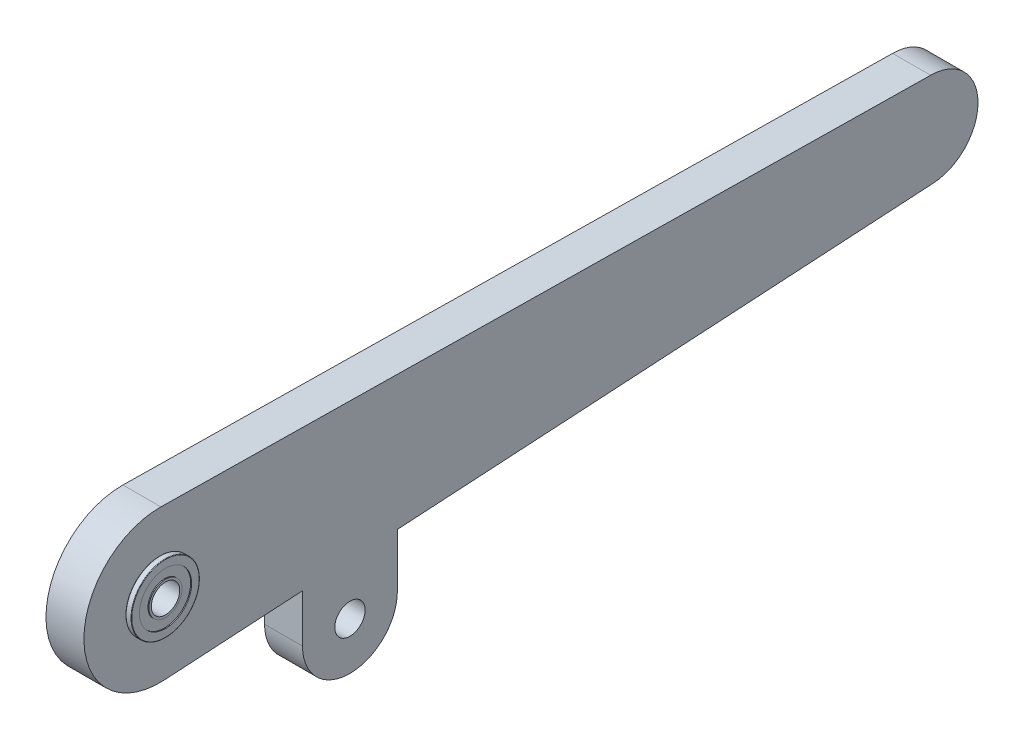
ISO-10303-21;
HEADER;
FILE_DESCRIPTION(('STEP AP214'),'2;1');
FILE_NAME('part.step','',(''),(''),'','','');
FILE_SCHEMA(('AUTOMOTIVE_DESIGN { 1 0 10303 214 1 1 1 1 }'));
ENDSEC;
DATA;
#1=APPLICATION_CONTEXT('core data for automotive mechanical design processes');
#2=APPLICATION_PROTOCOL_DEFINITION('international standard','automotive_design',2000,#1);
#3=PRODUCT_CONTEXT('',#1,'mechanical');
#4=PRODUCT('Part','Part','',(#3));
#5=PRODUCT_RELATED_PRODUCT_CATEGORY('part','',(#4));
#6=PRODUCT_DEFINITION_FORMATION('','',#4);
#7=PRODUCT_DEFINITION_CONTEXT('part definition',#1,'design');
#8=PRODUCT_DEFINITION('design','',#6,#7);
#9=PRODUCT_DEFINITION_SHAPE('','',#8);
#10=(LENGTH_UNIT() NAMED_UNIT(*) SI_UNIT(.MILLI.,.METRE.));
#11=(NAMED_UNIT(*) PLANE_ANGLE_UNIT() SI_UNIT($,.RADIAN.));
#12=(NAMED_UNIT(*) SI_UNIT($,.STERADIAN.) SOLID_ANGLE_UNIT());
#13=UNCERTAINTY_MEASURE_WITH_UNIT(LENGTH_MEASURE(1.E-05),#10,'distance_accuracy_value','');
#14=(GEOMETRIC_REPRESENTATION_CONTEXT(3) GLOBAL_UNCERTAINTY_ASSIGNED_CONTEXT((#13)) GLOBAL_UNIT_ASSIGNED_CONTEXT((#10,
#11,#12)) REPRESENTATION_CONTEXT('',''));
#15=CARTESIAN_POINT('',(0.,0.,0.));
#16=DIRECTION('',(0.,0.,1.));
#17=DIRECTION('',(1.,0.,0.));
#18=AXIS2_PLACEMENT_3D('',#15,#16,#17);
#19=CARTESIAN_POINT('',(3.35,0.,0.));
#20=DIRECTION('',(1.,0.,0.));
#21=DIRECTION('',(0.,0.,1.));
#22=AXIS2_PLACEMENT_3D('',#19,#20,#21);
#23=CYLINDRICAL_SURFACE('',#22,1.5);
#24=CARTESIAN_POINT('',(4.6,0.,0.));
#25=DIRECTION('',(1.,0.,0.));
#26=DIRECTION('',(0.,0.,-1.));
#27=AXIS2_PLACEMENT_3D('',#24,#25,#26);
#28=CIRCLE('',#27,1.5);
#29=CARTESIAN_POINT('',(4.59999999999999,0.,-1.50000000000002));
#30=VERTEX_POINT('',#29);
#31=EDGE_CURVE('P0_E28',#30,#30,#28,.T.);
#32=ORIENTED_EDGE('',*,*,#31,.T.);
#33=DIRECTION('',(-1.,0.,0.));
#34=VECTOR('',#33,1.);
#35=CARTESIAN_POINT('',(3.34999999999999,0.,-1.50000000000002));
#36=LINE('',#35,#34);
#37=CARTESIAN_POINT('',(2.09999999999999,0.,-1.50000000000001));
#38=VERTEX_POINT('',#37);
#39=EDGE_CURVE('P0_E11',#30,#38,#36,.T.);
#40=ORIENTED_EDGE('',*,*,#39,.T.);
#41=CARTESIAN_POINT('',(2.1,0.,0.));
#42=DIRECTION('',(1.,0.,0.));
#43=DIRECTION('',(0.,0.,-1.));
#44=AXIS2_PLACEMENT_3D('',#41,#42,#43);
#45=CIRCLE('',#44,1.5);
#46=EDGE_CURVE('P0_E179',#38,#38,#45,.T.);
#47=ORIENTED_EDGE('',*,*,#46,.F.);
#48=ORIENTED_EDGE('',*,*,#39,.F.);
#49=EDGE_LOOP('',(#32,#40,#47,#48));
#50=FACE_BOUND('',#49,.T.);
#51=ADVANCED_FACE('P0_F17',(#50),#23,.F.);
#52=CARTESIAN_POINT('',(4.6,0.,1.49999999999998));
#53=DIRECTION('',(1.,0.,0.));
#54=DIRECTION('',(0.,1.,0.));
#55=AXIS2_PLACEMENT_3D('',#52,#53,#54);
#56=PLANE('',#55);
#57=ORIENTED_EDGE('',*,*,#31,.F.);
#58=EDGE_LOOP('',(#57));
#59=FACE_BOUND('',#58,.T.);
#60=CARTESIAN_POINT('',(4.6,0.,0.));
#61=DIRECTION('',(1.,0.,0.));
#62=DIRECTION('',(0.,0.,-1.));
#63=AXIS2_PLACEMENT_3D('',#60,#61,#62);
#64=CIRCLE('',#63,1.75);
#65=CARTESIAN_POINT('',(4.60000000000001,0.,1.74999999999998));
#66=VERTEX_POINT('',#65);
#67=EDGE_CURVE('P0_E171',#66,#66,#64,.T.);
#68=ORIENTED_EDGE('',*,*,#67,.T.);
#69=EDGE_LOOP('',(#68));
#70=FACE_BOUND('',#69,.T.);
#71=ADVANCED_FACE('P0_F244',(#59,#70),#56,.T.);
#72=CARTESIAN_POINT('',(2.10000000000001,0.,2.99999999999999));
#73=DIRECTION('',(-1.,0.,0.));
#74=DIRECTION('',(0.,0.,-1.));
#75=AXIS2_PLACEMENT_3D('',#72,#73,#74);
#76=PLANE('',#75);
#77=ORIENTED_EDGE('',*,*,#46,.T.);
#78=EDGE_LOOP('',(#77));
#79=FACE_BOUND('',#78,.T.);
#80=CARTESIAN_POINT('',(2.1,0.,0.));
#81=DIRECTION('',(-1.,0.,0.));
#82=DIRECTION('',(0.,0.,1.));
#83=AXIS2_PLACEMENT_3D('',#80,#81,#82);
#84=CIRCLE('',#83,1.75);
#85=CARTESIAN_POINT('',(2.09999999999999,0.,-1.75000000000001));
#86=VERTEX_POINT('',#85);
#87=EDGE_CURVE('P0_E160',#86,#86,#84,.T.);
#88=ORIENTED_EDGE('',*,*,#87,.T.);
#89=EDGE_LOOP('',(#88));
#90=FACE_BOUND('',#89,.T.);
#91=ADVANCED_FACE('P0_F240',(#79,#90),#76,.T.);
#92=CARTESIAN_POINT('',(2.2,0.,0.));
#93=DIRECTION('',(-1.,0.,0.));
#94=DIRECTION('',(0.,0.,-1.));
#95=AXIS2_PLACEMENT_3D('',#92,#93,#94);
#96=PLANE('',#95);
#97=CARTESIAN_POINT('',(2.2,0.,0.));
#98=DIRECTION('',(-1.,0.,0.));
#99=DIRECTION('',(0.,0.,1.));
#100=AXIS2_PLACEMENT_3D('',#97,#98,#99);
#101=CIRCLE('',#100,1.75);
#102=CARTESIAN_POINT('',(2.19999999999999,0.,-1.75000000000001));
#103=VERTEX_POINT('',#102);
#104=EDGE_CURVE('P0_E21',#103,#103,#101,.T.);
#105=ORIENTED_EDGE('',*,*,#104,.F.);
#106=EDGE_LOOP('',(#105));
#107=FACE_BOUND('',#106,.T.);
#108=CARTESIAN_POINT('',(2.2,0.,0.));
#109=DIRECTION('',(1.,0.,0.));
#110=DIRECTION('',(0.,0.,1.));
#111=AXIS2_PLACEMENT_3D('',#108,#109,#110);
#112=CIRCLE('',#111,2.75);
#113=CARTESIAN_POINT('',(2.19999999999999,0.,-2.75000000000001));
#114=VERTEX_POINT('',#113);
#115=EDGE_CURVE('P0_E176',#114,#114,#112,.T.);
#116=ORIENTED_EDGE('',*,*,#115,.F.);
#117=EDGE_LOOP('',(#116));
#118=FACE_BOUND('',#117,.T.);
#119=ADVANCED_FACE('P0_F278',(#107,#118),#96,.T.);
#120=CARTESIAN_POINT('',(2.1,0.,0.));
#121=DIRECTION('',(1.,0.,0.));
#122=DIRECTION('',(0.,0.,1.));
#123=AXIS2_PLACEMENT_3D('',#120,#121,#122);
#124=CYLINDRICAL_SURFACE('',#123,2.75);
#125=CARTESIAN_POINT('',(2.1,0.,0.));
#126=DIRECTION('',(1.,0.,0.));
#127=DIRECTION('',(0.,0.,1.));
#128=AXIS2_PLACEMENT_3D('',#125,#126,#127);
#129=CIRCLE('',#128,2.75);
#130=CARTESIAN_POINT('',(2.09999999999999,0.,-2.75000000000001));
#131=VERTEX_POINT('',#130);
#132=EDGE_CURVE('P0_E172',#131,#131,#129,.T.);
#133=ORIENTED_EDGE('',*,*,#132,.F.);
#134=DIRECTION('',(1.,0.,0.));
#135=VECTOR('',#134,1.);
#136=CARTESIAN_POINT('',(2.09999999999999,0.,-2.75000000000001));
#137=LINE('',#136,#135);
#138=EDGE_CURVE('P0_E84',#131,#114,#137,.T.);
#139=ORIENTED_EDGE('',*,*,#138,.T.);
#140=ORIENTED_EDGE('',*,*,#115,.T.);
#141=ORIENTED_EDGE('',*,*,#138,.F.);
#142=EDGE_LOOP('',(#133,#139,#140,#141));
#143=FACE_BOUND('',#142,.T.);
#144=ADVANCED_FACE('P0_F281',(#143),#124,.F.);
#145=CARTESIAN_POINT('',(2.1,0.,0.));
#146=DIRECTION('',(1.,0.,0.));
#147=DIRECTION('',(0.,0.,1.));
#148=AXIS2_PLACEMENT_3D('',#145,#146,#147);
#149=CYLINDRICAL_SURFACE('',#148,1.75);
#150=ORIENTED_EDGE('',*,*,#87,.F.);
#151=DIRECTION('',(1.,0.,0.));
#152=VECTOR('',#151,1.);
#153=CARTESIAN_POINT('',(2.09999999999999,0.,-1.75000000000001));
#154=LINE('',#153,#152);
#155=EDGE_CURVE('P0_E54',#86,#103,#154,.T.);
#156=ORIENTED_EDGE('',*,*,#155,.T.);
#157=ORIENTED_EDGE('',*,*,#104,.T.);
#158=ORIENTED_EDGE('',*,*,#155,.F.);
#159=EDGE_LOOP('',(#150,#156,#157,#158));
#160=FACE_BOUND('',#159,.T.);
#161=ADVANCED_FACE('P0_F19',(#160),#149,.T.);
#162=CARTESIAN_POINT('',(4.5,0.,0.));
#163=DIRECTION('',(1.,0.,0.));
#164=DIRECTION('',(0.,1.,0.));
#165=AXIS2_PLACEMENT_3D('',#162,#163,#164);
#166=PLANE('',#165);
#167=CARTESIAN_POINT('',(4.5,0.,0.));
#168=DIRECTION('',(1.,0.,0.));
#169=DIRECTION('',(0.,0.,-1.));
#170=AXIS2_PLACEMENT_3D('',#167,#168,#169);
#171=CIRCLE('',#170,1.75);
#172=CARTESIAN_POINT('',(4.50000000000001,0.,1.74999999999998));
#173=VERTEX_POINT('',#172);
#174=EDGE_CURVE('P0_E188',#173,#173,#171,.T.);
#175=ORIENTED_EDGE('',*,*,#174,.F.);
#176=EDGE_LOOP('',(#175));
#177=FACE_BOUND('',#176,.T.);
#178=CARTESIAN_POINT('',(4.5,0.,0.));
#179=DIRECTION('',(-1.,0.,0.));
#180=DIRECTION('',(0.,0.,-1.));
#181=AXIS2_PLACEMENT_3D('',#178,#179,#180);
#182=CIRCLE('',#181,2.75);
#183=CARTESIAN_POINT('',(4.50000000000001,0.,2.74999999999998));
#184=VERTEX_POINT('',#183);
#185=EDGE_CURVE('P0_E69',#184,#184,#182,.T.);
#186=ORIENTED_EDGE('',*,*,#185,.F.);
#187=EDGE_LOOP('',(#186));
#188=FACE_BOUND('',#187,.T.);
#189=ADVANCED_FACE('P0_F260',(#177,#188),#166,.T.);
#190=CARTESIAN_POINT('',(4.6,0.,0.));
#191=DIRECTION('',(-1.,0.,0.));
#192=DIRECTION('',(0.,0.,-1.));
#193=AXIS2_PLACEMENT_3D('',#190,#191,#192);
#194=CYLINDRICAL_SURFACE('',#193,2.75);
#195=CARTESIAN_POINT('',(4.6,0.,0.));
#196=DIRECTION('',(-1.,0.,0.));
#197=DIRECTION('',(0.,0.,-1.));
#198=AXIS2_PLACEMENT_3D('',#195,#196,#197);
#199=CIRCLE('',#198,2.75);
#200=CARTESIAN_POINT('',(4.60000000000001,0.,2.74999999999998));
#201=VERTEX_POINT('',#200);
#202=EDGE_CURVE('P0_E155',#201,#201,#199,.T.);
#203=ORIENTED_EDGE('',*,*,#202,.F.);
#204=DIRECTION('',(-1.,0.,0.));
#205=VECTOR('',#204,1.);
#206=CARTESIAN_POINT('',(4.60000000000001,0.,2.74999999999998));
#207=LINE('',#206,#205);
#208=EDGE_CURVE('P0_E191',#201,#184,#207,.T.);
#209=ORIENTED_EDGE('',*,*,#208,.T.);
#210=ORIENTED_EDGE('',*,*,#185,.T.);
#211=ORIENTED_EDGE('',*,*,#208,.F.);
#212=EDGE_LOOP('',(#203,#209,#210,#211));
#213=FACE_BOUND('',#212,.T.);
#214=ADVANCED_FACE('P0_F218',(#213),#194,.F.);
#215=CARTESIAN_POINT('',(4.6,0.,0.));
#216=DIRECTION('',(-1.,0.,0.));
#217=DIRECTION('',(0.,0.,-1.));
#218=AXIS2_PLACEMENT_3D('',#215,#216,#217);
#219=CYLINDRICAL_SURFACE('',#218,1.75);
#220=ORIENTED_EDGE('',*,*,#67,.F.);
#221=DIRECTION('',(-1.,0.,0.));
#222=VECTOR('',#221,1.);
#223=CARTESIAN_POINT('',(4.60000000000001,0.,1.74999999999998));
#224=LINE('',#223,#222);
#225=EDGE_CURVE('P0_E184',#66,#173,#224,.T.);
#226=ORIENTED_EDGE('',*,*,#225,.T.);
#227=ORIENTED_EDGE('',*,*,#174,.T.);
#228=ORIENTED_EDGE('',*,*,#225,.F.);
#229=EDGE_LOOP('',(#220,#226,#227,#228));
#230=FACE_BOUND('',#229,.T.);
#231=ADVANCED_FACE('P0_F249',(#230),#219,.T.);
#232=CARTESIAN_POINT('',(3.05,0.,0.));
#233=DIRECTION('',(1.,0.,0.));
#234=DIRECTION('',(0.,0.,1.));
#235=AXIS2_PLACEMENT_3D('',#232,#233,#234);
#236=CYLINDRICAL_SURFACE('',#235,3.);
#237=CARTESIAN_POINT('',(4.,0.,0.));
#238=DIRECTION('',(1.,0.,0.));
#239=DIRECTION('',(0.,0.,-1.));
#240=AXIS2_PLACEMENT_3D('',#237,#238,#239);
#241=CIRCLE('',#240,3.);
#242=CARTESIAN_POINT('',(3.99999999999999,0.,-3.00000000000002));
#243=VERTEX_POINT('',#242);
#244=EDGE_CURVE('P0_E146',#243,#243,#241,.T.);
#245=ORIENTED_EDGE('',*,*,#244,.F.);
#246=DIRECTION('',(-1.,0.,0.));
#247=VECTOR('',#246,1.);
#248=CARTESIAN_POINT('',(3.04999999999999,0.,-3.00000000000002));
#249=LINE('',#248,#247);
#250=CARTESIAN_POINT('',(2.14999999999999,0.,-3.00000000000001));
#251=VERTEX_POINT('',#250);
#252=EDGE_CURVE('P0_E138',#243,#251,#249,.T.);
#253=ORIENTED_EDGE('',*,*,#252,.T.);
#254=CARTESIAN_POINT('',(2.15,0.,0.));
#255=DIRECTION('',(-1.,0.,0.));
#256=DIRECTION('',(0.,0.,-1.));
#257=AXIS2_PLACEMENT_3D('',#254,#255,#256);
#258=CIRCLE('',#257,3.);
#259=EDGE_CURVE('P0_E153',#251,#251,#258,.T.);
#260=ORIENTED_EDGE('',*,*,#259,.F.);
#261=ORIENTED_EDGE('',*,*,#252,.F.);
#262=EDGE_LOOP('',(#245,#253,#260,#261));
#263=FACE_BOUND('',#262,.T.);
#264=ADVANCED_FACE('P0_F251',(#263),#236,.T.);
#265=CARTESIAN_POINT('',(2.10000000000001,0.,2.99999999999999));
#266=DIRECTION('',(-1.,0.,0.));
#267=DIRECTION('',(0.,0.,-1.));
#268=AXIS2_PLACEMENT_3D('',#265,#266,#267);
#269=PLANE('',#268);
#270=ORIENTED_EDGE('',*,*,#132,.T.);
#271=EDGE_LOOP('',(#270));
#272=FACE_BOUND('',#271,.T.);
#273=CARTESIAN_POINT('',(2.1,0.,0.));
#274=DIRECTION('',(1.,0.,0.));
#275=DIRECTION('',(0.,0.,-1.));
#276=AXIS2_PLACEMENT_3D('',#273,#274,#275);
#277=CIRCLE('',#276,2.95);
#278=CARTESIAN_POINT('',(2.09999999999999,0.,-2.95000000000001));
#279=VERTEX_POINT('',#278);
#280=EDGE_CURVE('P0_E99',#279,#279,#277,.T.);
#281=ORIENTED_EDGE('',*,*,#280,.F.);
#282=EDGE_LOOP('',(#281));
#283=FACE_BOUND('',#282,.T.);
#284=ADVANCED_FACE('P0_F258',(#272,#283),#269,.T.);
#285=CARTESIAN_POINT('',(2.15,0.,0.));
#286=DIRECTION('',(1.,0.,0.));
#287=DIRECTION('',(0.,0.,1.));
#288=AXIS2_PLACEMENT_3D('',#285,#286,#287);
#289=TOROIDAL_SURFACE('',#288,2.95,0.05);
#290=ORIENTED_EDGE('',*,*,#259,.T.);
#291=CARTESIAN_POINT('',(2.14999999999999,0.,-2.95000000000001));
#292=DIRECTION('',(0.,1.,0.));
#293=DIRECTION('',(0.,0.,-1.));
#294=AXIS2_PLACEMENT_3D('',#291,#292,#293);
#295=CIRCLE('',#294,0.05);
#296=EDGE_CURVE('P0_E183',#251,#279,#295,.T.);
#297=ORIENTED_EDGE('',*,*,#296,.T.);
#298=ORIENTED_EDGE('',*,*,#280,.T.);
#299=ORIENTED_EDGE('',*,*,#296,.F.);
#300=EDGE_LOOP('',(#290,#297,#298,#299));
#301=FACE_BOUND('',#300,.T.);
#302=ADVANCED_FACE('P0_F273',(#301),#289,.T.);
#303=CARTESIAN_POINT('',(4.00000000000001,0.,3.59999999999998));
#304=DIRECTION('',(-1.,0.,0.));
#305=DIRECTION('',(0.,0.,-1.));
#306=AXIS2_PLACEMENT_3D('',#303,#304,#305);
#307=PLANE('',#306);
#308=ORIENTED_EDGE('',*,*,#244,.T.);
#309=EDGE_LOOP('',(#308));
#310=FACE_BOUND('',#309,.T.);
#311=CARTESIAN_POINT('',(4.,0.,0.));
#312=DIRECTION('',(1.,0.,0.));
#313=DIRECTION('',(0.,0.,-1.));
#314=AXIS2_PLACEMENT_3D('',#311,#312,#313);
#315=CIRCLE('',#314,3.55);
#316=CARTESIAN_POINT('',(3.99999999999999,0.,-3.55000000000002));
#317=VERTEX_POINT('',#316);
#318=EDGE_CURVE('P0_E142',#317,#317,#315,.T.);
#319=ORIENTED_EDGE('',*,*,#318,.F.);
#320=EDGE_LOOP('',(#319));
#321=FACE_BOUND('',#320,.T.);
#322=ADVANCED_FACE('P0_F270',(#310,#321),#307,.T.);
#323=CARTESIAN_POINT('',(4.05,0.,0.));
#324=DIRECTION('',(1.,0.,0.));
#325=DIRECTION('',(0.,0.,1.));
#326=AXIS2_PLACEMENT_3D('',#323,#324,#325);
#327=TOROIDAL_SURFACE('',#326,3.55,0.05);
#328=CARTESIAN_POINT('',(4.05,0.,0.));
#329=DIRECTION('',(-1.,0.,0.));
#330=DIRECTION('',(0.,0.,-1.));
#331=AXIS2_PLACEMENT_3D('',#328,#329,#330);
#332=CIRCLE('',#331,3.6);
#333=CARTESIAN_POINT('',(4.04999999999999,0.,-3.60000000000002));
#334=VERTEX_POINT('',#333);
#335=EDGE_CURVE('P0_E173',#334,#334,#332,.T.);
#336=ORIENTED_EDGE('',*,*,#335,.T.);
#337=CARTESIAN_POINT('',(4.04999999999999,0.,-3.55000000000002));
#338=DIRECTION('',(0.,1.,0.));
#339=DIRECTION('',(0.,0.,-1.));
#340=AXIS2_PLACEMENT_3D('',#337,#338,#339);
#341=CIRCLE('',#340,0.05);
#342=EDGE_CURVE('P0_E118',#334,#317,#341,.T.);
#343=ORIENTED_EDGE('',*,*,#342,.T.);
#344=ORIENTED_EDGE('',*,*,#318,.T.);
#345=ORIENTED_EDGE('',*,*,#342,.F.);
#346=EDGE_LOOP('',(#336,#343,#344,#345));
#347=FACE_BOUND('',#346,.T.);
#348=ADVANCED_FACE('P0_F143',(#347),#327,.T.);
#349=CARTESIAN_POINT('',(4.6,0.,1.49999999999998));
#350=DIRECTION('',(1.,0.,0.));
#351=DIRECTION('',(0.,1.,0.));
#352=AXIS2_PLACEMENT_3D('',#349,#350,#351);
#353=PLANE('',#352);
#354=ORIENTED_EDGE('',*,*,#202,.T.);
#355=EDGE_LOOP('',(#354));
#356=FACE_BOUND('',#355,.T.);
#357=CARTESIAN_POINT('',(4.6,0.,0.));
#358=DIRECTION('',(-1.,0.,0.));
#359=DIRECTION('',(0.,0.,-1.));
#360=AXIS2_PLACEMENT_3D('',#357,#358,#359);
#361=CIRCLE('',#360,3.55);
#362=CARTESIAN_POINT('',(4.59999999999999,0.,-3.55000000000002));
#363=VERTEX_POINT('',#362);
#364=EDGE_CURVE('P0_E168',#363,#363,#361,.T.);
#365=ORIENTED_EDGE('',*,*,#364,.F.);
#366=EDGE_LOOP('',(#365));
#367=FACE_BOUND('',#366,.T.);
#368=ADVANCED_FACE('P0_F216',(#356,#367),#353,.T.);
#369=CARTESIAN_POINT('',(4.3,0.,0.));
#370=DIRECTION('',(1.,0.,0.));
#371=DIRECTION('',(0.,0.,1.));
#372=AXIS2_PLACEMENT_3D('',#369,#370,#371);
#373=CYLINDRICAL_SURFACE('',#372,3.6);
#374=CARTESIAN_POINT('',(4.55,0.,0.));
#375=DIRECTION('',(1.,0.,0.));
#376=DIRECTION('',(0.,0.,-1.));
#377=AXIS2_PLACEMENT_3D('',#374,#375,#376);
#378=CIRCLE('',#377,3.6);
#379=CARTESIAN_POINT('',(4.54999999999999,0.,-3.60000000000002));
#380=VERTEX_POINT('',#379);
#381=EDGE_CURVE('P0_E167',#380,#380,#378,.T.);
#382=ORIENTED_EDGE('',*,*,#381,.F.);
#383=DIRECTION('',(-1.,0.,0.));
#384=VECTOR('',#383,1.);
#385=CARTESIAN_POINT('',(4.29999999999999,0.,-3.60000000000002));
#386=LINE('',#385,#384);
#387=EDGE_CURVE('P0_E128',#380,#334,#386,.T.);
#388=ORIENTED_EDGE('',*,*,#387,.T.);
#389=ORIENTED_EDGE('',*,*,#335,.F.);
#390=ORIENTED_EDGE('',*,*,#387,.F.);
#391=EDGE_LOOP('',(#382,#388,#389,#390));
#392=FACE_BOUND('',#391,.T.);
#393=ADVANCED_FACE('P0_F277',(#392),#373,.T.);
#394=CARTESIAN_POINT('',(4.55,0.,0.));
#395=DIRECTION('',(1.,0.,0.));
#396=DIRECTION('',(0.,0.,1.));
#397=AXIS2_PLACEMENT_3D('',#394,#395,#396);
#398=TOROIDAL_SURFACE('',#397,3.55,0.05);
#399=ORIENTED_EDGE('',*,*,#364,.T.);
#400=CARTESIAN_POINT('',(4.54999999999999,0.,-3.55000000000002));
#401=DIRECTION('',(0.,1.,0.));
#402=DIRECTION('',(0.,0.,-1.));
#403=AXIS2_PLACEMENT_3D('',#400,#401,#402);
#404=CIRCLE('',#403,0.05);
#405=EDGE_CURVE('P0_E163',#363,#380,#404,.T.);
#406=ORIENTED_EDGE('',*,*,#405,.T.);
#407=ORIENTED_EDGE('',*,*,#381,.T.);
#408=ORIENTED_EDGE('',*,*,#405,.F.);
#409=EDGE_LOOP('',(#399,#406,#407,#408));
#410=FACE_BOUND('',#409,.T.);
#411=ADVANCED_FACE('P0_F268',(#410),#398,.T.);
#412=CLOSED_SHELL('',(#51,#71,#91,#119,#144,#161,#189,#214,#231,#264,#284,#302,#322,#348,#368,
#393,#411));
#413=MANIFOLD_SOLID_BREP('P0_B1',#412);
#414=CARTESIAN_POINT('',(0.65,0.,0.));
#415=DIRECTION('',(-1.,0.,0.));
#416=DIRECTION('',(0.,0.,1.));
#417=AXIS2_PLACEMENT_3D('',#414,#415,#416);
#418=CYLINDRICAL_SURFACE('',#417,1.5);
#419=CARTESIAN_POINT('',(-0.6,0.,0.));
#420=DIRECTION('',(-1.,0.,0.));
#421=DIRECTION('',(0.,0.,-1.));
#422=AXIS2_PLACEMENT_3D('',#419,#420,#421);
#423=CIRCLE('',#422,1.5);
#424=CARTESIAN_POINT('',(-0.600000000000005,0.,-1.49999999999999));
#425=VERTEX_POINT('',#424);
#426=EDGE_CURVE('P1_E27',#425,#425,#423,.T.);
#427=ORIENTED_EDGE('',*,*,#426,.T.);
#428=DIRECTION('',(1.,0.,0.));
#429=VECTOR('',#428,1.);
#430=CARTESIAN_POINT('',(0.649999999999995,0.,-1.5));
#431=LINE('',#430,#429);
#432=CARTESIAN_POINT('',(1.9,0.,-1.5));
#433=VERTEX_POINT('',#432);
#434=EDGE_CURVE('P1_E10',#425,#433,#431,.T.);
#435=ORIENTED_EDGE('',*,*,#434,.T.);
#436=CARTESIAN_POINT('',(1.9,0.,0.));
#437=DIRECTION('',(-1.,0.,0.));
#438=DIRECTION('',(0.,0.,-1.));
#439=AXIS2_PLACEMENT_3D('',#436,#437,#438);
#440=CIRCLE('',#439,1.5);
#441=EDGE_CURVE('P1_E178',#433,#433,#440,.T.);
#442=ORIENTED_EDGE('',*,*,#441,.F.);
#443=ORIENTED_EDGE('',*,*,#434,.F.);
#444=EDGE_LOOP('',(#427,#435,#442,#443));
#445=FACE_BOUND('',#444,.T.);
#446=ADVANCED_FACE('P1_F16',(#445),#418,.F.);
#447=CARTESIAN_POINT('',(-0.599999999999995,0.,1.50000000000001));
#448=DIRECTION('',(-1.,0.,0.));
#449=DIRECTION('',(0.,-1.,0.));
#450=AXIS2_PLACEMENT_3D('',#447,#448,#449);
#451=PLANE('',#450);
#452=ORIENTED_EDGE('',*,*,#426,.F.);
#453=EDGE_LOOP('',(#452));
#454=FACE_BOUND('',#453,.T.);
#455=CARTESIAN_POINT('',(-0.6,0.,0.));
#456=DIRECTION('',(-1.,0.,0.));
#457=DIRECTION('',(0.,0.,-1.));
#458=AXIS2_PLACEMENT_3D('',#455,#456,#457);
#459=CIRCLE('',#458,1.75);
#460=CARTESIAN_POINT('',(-0.599999999999994,0.,1.75000000000001));
#461=VERTEX_POINT('',#460);
#462=EDGE_CURVE('P1_E170',#461,#461,#459,.T.);
#463=ORIENTED_EDGE('',*,*,#462,.T.);
#464=EDGE_LOOP('',(#463));
#465=FACE_BOUND('',#464,.T.);
#466=ADVANCED_FACE('P1_F243',(#454,#465),#451,.T.);
#467=CARTESIAN_POINT('',(1.90000000000001,0.,3.));
#468=DIRECTION('',(1.,0.,0.));
#469=DIRECTION('',(0.,0.,-1.));
#470=AXIS2_PLACEMENT_3D('',#467,#468,#469);
#471=PLANE('',#470);
#472=ORIENTED_EDGE('',*,*,#441,.T.);
#473=EDGE_LOOP('',(#472));
#474=FACE_BOUND('',#473,.T.);
#475=CARTESIAN_POINT('',(1.9,0.,0.));
#476=DIRECTION('',(1.,0.,0.));
#477=DIRECTION('',(0.,0.,1.));
#478=AXIS2_PLACEMENT_3D('',#475,#476,#477);
#479=CIRCLE('',#478,1.75);
#480=CARTESIAN_POINT('',(1.89999999999999,0.,-1.75));
#481=VERTEX_POINT('',#480);
#482=EDGE_CURVE('P1_E159',#481,#481,#479,.T.);
#483=ORIENTED_EDGE('',*,*,#482,.T.);
#484=EDGE_LOOP('',(#483));
#485=FACE_BOUND('',#484,.T.);
#486=ADVANCED_FACE('P1_F239',(#474,#485),#471,.T.);
#487=CARTESIAN_POINT('',(1.8,0.,0.));
#488=DIRECTION('',(1.,0.,0.));
#489=DIRECTION('',(0.,0.,-1.));
#490=AXIS2_PLACEMENT_3D('',#487,#488,#489);
#491=PLANE('',#490);
#492=CARTESIAN_POINT('',(1.8,0.,0.));
#493=DIRECTION('',(1.,0.,0.));
#494=DIRECTION('',(0.,0.,1.));
#495=AXIS2_PLACEMENT_3D('',#492,#493,#494);
#496=CIRCLE('',#495,1.75);
#497=CARTESIAN_POINT('',(1.79999999999999,0.,-1.75));
#498=VERTEX_POINT('',#497);
#499=EDGE_CURVE('P1_E20',#498,#498,#496,.T.);
#500=ORIENTED_EDGE('',*,*,#499,.F.);
#501=EDGE_LOOP('',(#500));
#502=FACE_BOUND('',#501,.T.);
#503=CARTESIAN_POINT('',(1.8,0.,0.));
#504=DIRECTION('',(-1.,0.,0.));
#505=DIRECTION('',(0.,0.,1.));
#506=AXIS2_PLACEMENT_3D('',#503,#504,#505);
#507=CIRCLE('',#506,2.75);
#508=CARTESIAN_POINT('',(1.79999999999999,0.,-2.75));
#509=VERTEX_POINT('',#508);
#510=EDGE_CURVE('P1_E175',#509,#509,#507,.T.);
#511=ORIENTED_EDGE('',*,*,#510,.F.);
#512=EDGE_LOOP('',(#511));
#513=FACE_BOUND('',#512,.T.);
#514=ADVANCED_FACE('P1_F277',(#502,#513),#491,.T.);
#515=CARTESIAN_POINT('',(1.9,0.,0.));
#516=DIRECTION('',(-1.,0.,0.));
#517=DIRECTION('',(0.,0.,1.));
#518=AXIS2_PLACEMENT_3D('',#515,#516,#517);
#519=CYLINDRICAL_SURFACE('',#518,2.75);
#520=CARTESIAN_POINT('',(1.9,0.,0.));
#521=DIRECTION('',(-1.,0.,0.));
#522=DIRECTION('',(0.,0.,1.));
#523=AXIS2_PLACEMENT_3D('',#520,#521,#522);
#524=CIRCLE('',#523,2.75);
#525=CARTESIAN_POINT('',(1.89999999999999,0.,-2.75));
#526=VERTEX_POINT('',#525);
#527=EDGE_CURVE('P1_E171',#526,#526,#524,.T.);
#528=ORIENTED_EDGE('',*,*,#527,.F.);
#529=DIRECTION('',(-1.,0.,0.));
#530=VECTOR('',#529,1.);
#531=CARTESIAN_POINT('',(1.89999999999999,0.,-2.75));
#532=LINE('',#531,#530);
#533=EDGE_CURVE('P1_E83',#526,#509,#532,.T.);
#534=ORIENTED_EDGE('',*,*,#533,.T.);
#535=ORIENTED_EDGE('',*,*,#510,.T.);
#536=ORIENTED_EDGE('',*,*,#533,.F.);
#537=EDGE_LOOP('',(#528,#534,#535,#536));
#538=FACE_BOUND('',#537,.T.);
#539=ADVANCED_FACE('P1_F280',(#538),#519,.F.);
#540=CARTESIAN_POINT('',(1.9,0.,0.));
#541=DIRECTION('',(-1.,0.,0.));
#542=DIRECTION('',(0.,0.,1.));
#543=AXIS2_PLACEMENT_3D('',#540,#541,#542);
#544=CYLINDRICAL_SURFACE('',#543,1.75);
#545=ORIENTED_EDGE('',*,*,#482,.F.);
#546=DIRECTION('',(-1.,0.,0.));
#547=VECTOR('',#546,1.);
#548=CARTESIAN_POINT('',(1.89999999999999,0.,-1.75));
#549=LINE('',#548,#547);
#550=EDGE_CURVE('P1_E53',#481,#498,#549,.T.);
#551=ORIENTED_EDGE('',*,*,#550,.T.);
#552=ORIENTED_EDGE('',*,*,#499,.T.);
#553=ORIENTED_EDGE('',*,*,#550,.F.);
#554=EDGE_LOOP('',(#545,#551,#552,#553));
#555=FACE_BOUND('',#554,.T.);
#556=ADVANCED_FACE('P1_F18',(#555),#544,.T.);
#557=CARTESIAN_POINT('',(-0.5,0.,0.));
#558=DIRECTION('',(-1.,0.,0.));
#559=DIRECTION('',(0.,-1.,0.));
#560=AXIS2_PLACEMENT_3D('',#557,#558,#559);
#561=PLANE('',#560);
#562=CARTESIAN_POINT('',(-0.5,0.,0.));
#563=DIRECTION('',(-1.,0.,0.));
#564=DIRECTION('',(0.,0.,-1.));
#565=AXIS2_PLACEMENT_3D('',#562,#563,#564);
#566=CIRCLE('',#565,1.75);
#567=CARTESIAN_POINT('',(-0.499999999999994,0.,1.75000000000001));
#568=VERTEX_POINT('',#567);
#569=EDGE_CURVE('P1_E187',#568,#568,#566,.T.);
#570=ORIENTED_EDGE('',*,*,#569,.F.);
#571=EDGE_LOOP('',(#570));
#572=FACE_BOUND('',#571,.T.);
#573=CARTESIAN_POINT('',(-0.5,0.,0.));
#574=DIRECTION('',(1.,0.,0.));
#575=DIRECTION('',(0.,0.,-1.));
#576=AXIS2_PLACEMENT_3D('',#573,#574,#575);
#577=CIRCLE('',#576,2.75);
#578=CARTESIAN_POINT('',(-0.49999999999999,0.,2.75000000000001));
#579=VERTEX_POINT('',#578);
#580=EDGE_CURVE('P1_E68',#579,#579,#577,.T.);
#581=ORIENTED_EDGE('',*,*,#580,.F.);
#582=EDGE_LOOP('',(#581));
#583=FACE_BOUND('',#582,.T.);
#584=ADVANCED_FACE('P1_F259',(#572,#583),#561,.T.);
#585=CARTESIAN_POINT('',(-0.6,0.,0.));
#586=DIRECTION('',(1.,0.,0.));
#587=DIRECTION('',(0.,0.,-1.));
#588=AXIS2_PLACEMENT_3D('',#585,#586,#587);
#589=CYLINDRICAL_SURFACE('',#588,2.75);
#590=CARTESIAN_POINT('',(-0.6,0.,0.));
#591=DIRECTION('',(1.,0.,0.));
#592=DIRECTION('',(0.,0.,-1.));
#593=AXIS2_PLACEMENT_3D('',#590,#591,#592);
#594=CIRCLE('',#593,2.75);
#595=CARTESIAN_POINT('',(-0.59999999999999,0.,2.75000000000001));
#596=VERTEX_POINT('',#595);
#597=EDGE_CURVE('P1_E154',#596,#596,#594,.T.);
#598=ORIENTED_EDGE('',*,*,#597,.F.);
#599=DIRECTION('',(1.,0.,0.));
#600=VECTOR('',#599,1.);
#601=CARTESIAN_POINT('',(-0.59999999999999,0.,2.75000000000001));
#602=LINE('',#601,#600);
#603=EDGE_CURVE('P1_E190',#596,#579,#602,.T.);
#604=ORIENTED_EDGE('',*,*,#603,.T.);
#605=ORIENTED_EDGE('',*,*,#580,.T.);
#606=ORIENTED_EDGE('',*,*,#603,.F.);
#607=EDGE_LOOP('',(#598,#604,#605,#606));
#608=FACE_BOUND('',#607,.T.);
#609=ADVANCED_FACE('P1_F217',(#608),#589,.F.);
#610=CARTESIAN_POINT('',(-0.6,0.,0.));
#611=DIRECTION('',(1.,0.,0.));
#612=DIRECTION('',(0.,0.,-1.));
#613=AXIS2_PLACEMENT_3D('',#610,#611,#612);
#614=CYLINDRICAL_SURFACE('',#613,1.75);
#615=ORIENTED_EDGE('',*,*,#462,.F.);
#616=DIRECTION('',(1.,0.,0.));
#617=VECTOR('',#616,1.);
#618=CARTESIAN_POINT('',(-0.599999999999994,0.,1.75000000000001));
#619=LINE('',#618,#617);
#620=EDGE_CURVE('P1_E183',#461,#568,#619,.T.);
#621=ORIENTED_EDGE('',*,*,#620,.T.);
#622=ORIENTED_EDGE('',*,*,#569,.T.);
#623=ORIENTED_EDGE('',*,*,#620,.F.);
#624=EDGE_LOOP('',(#615,#621,#622,#623));
#625=FACE_BOUND('',#624,.T.);
#626=ADVANCED_FACE('P1_F248',(#625),#614,.T.);
#627=CARTESIAN_POINT('',(0.95,0.,0.));
#628=DIRECTION('',(-1.,0.,0.));
#629=DIRECTION('',(0.,0.,1.));
#630=AXIS2_PLACEMENT_3D('',#627,#628,#629);
#631=CYLINDRICAL_SURFACE('',#630,3.);
#632=CARTESIAN_POINT('',(0.,0.,0.));
#633=DIRECTION('',(-1.,0.,0.));
#634=DIRECTION('',(0.,0.,-1.));
#635=AXIS2_PLACEMENT_3D('',#632,#633,#634);
#636=CIRCLE('',#635,3.);
#637=CARTESIAN_POINT('',(0.,0.,-3.));
#638=VERTEX_POINT('',#637);
#639=EDGE_CURVE('P1_E145',#638,#638,#636,.T.);
#640=ORIENTED_EDGE('',*,*,#639,.F.);
#641=DIRECTION('',(1.,0.,0.));
#642=VECTOR('',#641,1.);
#643=CARTESIAN_POINT('',(0.94999999999999,0.,-3.));
#644=LINE('',#643,#642);
#645=CARTESIAN_POINT('',(1.84999999999999,0.,-3.));
#646=VERTEX_POINT('',#645);
#647=EDGE_CURVE('P1_E137',#638,#646,#644,.T.);
#648=ORIENTED_EDGE('',*,*,#647,.T.);
#649=CARTESIAN_POINT('',(1.85,0.,0.));
#650=DIRECTION('',(1.,0.,0.));
#651=DIRECTION('',(0.,0.,-1.));
#652=AXIS2_PLACEMENT_3D('',#649,#650,#651);
#653=CIRCLE('',#652,3.);
#654=EDGE_CURVE('P1_E152',#646,#646,#653,.T.);
#655=ORIENTED_EDGE('',*,*,#654,.F.);
#656=ORIENTED_EDGE('',*,*,#647,.F.);
#657=EDGE_LOOP('',(#640,#648,#655,#656));
#658=FACE_BOUND('',#657,.T.);
#659=ADVANCED_FACE('P1_F250',(#658),#631,.T.);
#660=CARTESIAN_POINT('',(1.90000000000001,0.,3.));
#661=DIRECTION('',(1.,0.,0.));
#662=DIRECTION('',(0.,0.,-1.));
#663=AXIS2_PLACEMENT_3D('',#660,#661,#662);
#664=PLANE('',#663);
#665=ORIENTED_EDGE('',*,*,#527,.T.);
#666=EDGE_LOOP('',(#665));
#667=FACE_BOUND('',#666,.T.);
#668=CARTESIAN_POINT('',(1.9,0.,0.));
#669=DIRECTION('',(-1.,0.,0.));
#670=DIRECTION('',(0.,0.,-1.));
#671=AXIS2_PLACEMENT_3D('',#668,#669,#670);
#672=CIRCLE('',#671,2.95);
#673=CARTESIAN_POINT('',(1.89999999999999,0.,-2.95));
#674=VERTEX_POINT('',#673);
#675=EDGE_CURVE('P1_E98',#674,#674,#672,.T.);
#676=ORIENTED_EDGE('',*,*,#675,.F.);
#677=EDGE_LOOP('',(#676));
#678=FACE_BOUND('',#677,.T.);
#679=ADVANCED_FACE('P1_F257',(#667,#678),#664,.T.);
#680=CARTESIAN_POINT('',(1.85,0.,0.));
#681=DIRECTION('',(-1.,0.,0.));
#682=DIRECTION('',(0.,0.,1.));
#683=AXIS2_PLACEMENT_3D('',#680,#681,#682);
#684=TOROIDAL_SURFACE('',#683,2.95,0.05);
#685=ORIENTED_EDGE('',*,*,#654,.T.);
#686=CARTESIAN_POINT('',(1.84999999999999,0.,-2.95));
#687=DIRECTION('',(0.,-1.,0.));
#688=DIRECTION('',(0.,0.,-1.));
#689=AXIS2_PLACEMENT_3D('',#686,#687,#688);
#690=CIRCLE('',#689,0.05);
#691=EDGE_CURVE('P1_E182',#646,#674,#690,.T.);
#692=ORIENTED_EDGE('',*,*,#691,.T.);
#693=ORIENTED_EDGE('',*,*,#675,.T.);
#694=ORIENTED_EDGE('',*,*,#691,.F.);
#695=EDGE_LOOP('',(#685,#692,#693,#694));
#696=FACE_BOUND('',#695,.T.);
#697=ADVANCED_FACE('P1_F272',(#696),#684,.T.);
#698=CARTESIAN_POINT('',(0.,0.,3.6));
#699=DIRECTION('',(1.,0.,0.));
#700=DIRECTION('',(0.,0.,-1.));
#701=AXIS2_PLACEMENT_3D('',#698,#699,#700);
#702=PLANE('',#701);
#703=ORIENTED_EDGE('',*,*,#639,.T.);
#704=EDGE_LOOP('',(#703));
#705=FACE_BOUND('',#704,.T.);
#706=CARTESIAN_POINT('',(0.,0.,0.));
#707=DIRECTION('',(-1.,0.,0.));
#708=DIRECTION('',(0.,0.,-1.));
#709=AXIS2_PLACEMENT_3D('',#706,#707,#708);
#710=CIRCLE('',#709,3.55);
#711=CARTESIAN_POINT('',(0.,0.,-3.55));
#712=VERTEX_POINT('',#711);
#713=EDGE_CURVE('P1_E141',#712,#712,#710,.T.);
#714=ORIENTED_EDGE('',*,*,#713,.F.);
#715=EDGE_LOOP('',(#714));
#716=FACE_BOUND('',#715,.T.);
#717=ADVANCED_FACE('P1_F269',(#705,#716),#702,.T.);
#718=CARTESIAN_POINT('',(-0.0499999999999998,0.,0.));
#719=DIRECTION('',(-1.,0.,0.));
#720=DIRECTION('',(0.,0.,1.));
#721=AXIS2_PLACEMENT_3D('',#718,#719,#720);
#722=TOROIDAL_SURFACE('',#721,3.55,0.05);
#723=CARTESIAN_POINT('',(-0.0499999999999998,0.,0.));
#724=DIRECTION('',(1.,0.,0.));
#725=DIRECTION('',(0.,0.,-1.));
#726=AXIS2_PLACEMENT_3D('',#723,#724,#725);
#727=CIRCLE('',#726,3.6);
#728=CARTESIAN_POINT('',(-0.0500000000000124,0.,-3.6));
#729=VERTEX_POINT('',#728);
#730=EDGE_CURVE('P1_E172',#729,#729,#727,.T.);
#731=ORIENTED_EDGE('',*,*,#730,.T.);
#732=CARTESIAN_POINT('',(-0.0500000000000122,0.,-3.55));
#733=DIRECTION('',(0.,-1.,0.));
#734=DIRECTION('',(0.,0.,-1.));
#735=AXIS2_PLACEMENT_3D('',#732,#733,#734);
#736=CIRCLE('',#735,0.05);
#737=EDGE_CURVE('P1_E117',#729,#712,#736,.T.);
#738=ORIENTED_EDGE('',*,*,#737,.T.);
#739=ORIENTED_EDGE('',*,*,#713,.T.);
#740=ORIENTED_EDGE('',*,*,#737,.F.);
#741=EDGE_LOOP('',(#731,#738,#739,#740));
#742=FACE_BOUND('',#741,.T.);
#743=ADVANCED_FACE('P1_F142',(#742),#722,.T.);
#744=CARTESIAN_POINT('',(-0.599999999999995,0.,1.50000000000001));
#745=DIRECTION('',(-1.,0.,0.));
#746=DIRECTION('',(0.,-1.,0.));
#747=AXIS2_PLACEMENT_3D('',#744,#745,#746);
#748=PLANE('',#747);
#749=ORIENTED_EDGE('',*,*,#597,.T.);
#750=EDGE_LOOP('',(#749));
#751=FACE_BOUND('',#750,.T.);
#752=CARTESIAN_POINT('',(-0.6,0.,0.));
#753=DIRECTION('',(1.,0.,0.));
#754=DIRECTION('',(0.,0.,-1.));
#755=AXIS2_PLACEMENT_3D('',#752,#753,#754);
#756=CIRCLE('',#755,3.55);
#757=CARTESIAN_POINT('',(-0.600000000000012,0.,-3.54999999999999));
#758=VERTEX_POINT('',#757);
#759=EDGE_CURVE('P1_E167',#758,#758,#756,.T.);
#760=ORIENTED_EDGE('',*,*,#759,.F.);
#761=EDGE_LOOP('',(#760));
#762=FACE_BOUND('',#761,.T.);
#763=ADVANCED_FACE('P1_F215',(#751,#762),#748,.T.);
#764=CARTESIAN_POINT('',(-0.3,0.,0.));
#765=DIRECTION('',(-1.,0.,0.));
#766=DIRECTION('',(0.,0.,1.));
#767=AXIS2_PLACEMENT_3D('',#764,#765,#766);
#768=CYLINDRICAL_SURFACE('',#767,3.6);
#769=CARTESIAN_POINT('',(-0.55,0.,0.));
#770=DIRECTION('',(-1.,0.,0.));
#771=DIRECTION('',(0.,0.,-1.));
#772=AXIS2_PLACEMENT_3D('',#769,#770,#771);
#773=CIRCLE('',#772,3.6);
#774=CARTESIAN_POINT('',(-0.550000000000012,0.,-3.59999999999999));
#775=VERTEX_POINT('',#774);
#776=EDGE_CURVE('P1_E166',#775,#775,#773,.T.);
#777=ORIENTED_EDGE('',*,*,#776,.F.);
#778=DIRECTION('',(1.,0.,0.));
#779=VECTOR('',#778,1.);
#780=CARTESIAN_POINT('',(-0.300000000000012,0.,-3.59999999999999));
#781=LINE('',#780,#779);
#782=EDGE_CURVE('P1_E127',#775,#729,#781,.T.);
#783=ORIENTED_EDGE('',*,*,#782,.T.);
#784=ORIENTED_EDGE('',*,*,#730,.F.);
#785=ORIENTED_EDGE('',*,*,#782,.F.);
#786=EDGE_LOOP('',(#777,#783,#784,#785));
#787=FACE_BOUND('',#786,.T.);
#788=ADVANCED_FACE('P1_F276',(#787),#768,.T.);
#789=CARTESIAN_POINT('',(-0.55,0.,0.));
#790=DIRECTION('',(-1.,0.,0.));
#791=DIRECTION('',(0.,0.,1.));
#792=AXIS2_PLACEMENT_3D('',#789,#790,#791);
#793=TOROIDAL_SURFACE('',#792,3.55,0.05);
#794=ORIENTED_EDGE('',*,*,#759,.T.);
#795=CARTESIAN_POINT('',(-0.550000000000012,0.,-3.54999999999999));
#796=DIRECTION('',(0.,-1.,0.));
#797=DIRECTION('',(0.,0.,-1.));
#798=AXIS2_PLACEMENT_3D('',#795,#796,#797);
#799=CIRCLE('',#798,0.05);
#800=EDGE_CURVE('P1_E162',#758,#775,#799,.T.);
#801=ORIENTED_EDGE('',*,*,#800,.T.);
#802=ORIENTED_EDGE('',*,*,#776,.T.);
#803=ORIENTED_EDGE('',*,*,#800,.F.);
#804=EDGE_LOOP('',(#794,#801,#802,#803));
#805=FACE_BOUND('',#804,.T.);
#806=ADVANCED_FACE('P1_F267',(#805),#793,.T.);
#807=CLOSED_SHELL('',(#446,#466,#486,#514,#539,#556,#584,#609,#626,#659,#679,#697,#717,#743,
#763,#788,#806));
#808=MANIFOLD_SOLID_BREP('P1_B1',#807);
#809=CARTESIAN_POINT('',(4.,0.,0.));
#810=DIRECTION('',(1.,0.,0.));
#811=DIRECTION('',(0.,0.,-1.));
#812=AXIS2_PLACEMENT_3D('',#809,#810,#811);
#813=PLANE('',#812);
#814=CARTESIAN_POINT('',(4.,-12.1735942097107,-20.0375638568582));
#815=DIRECTION('',(1.,0.,0.));
#816=DIRECTION('',(0.,0.,-1.));
#817=AXIS2_PLACEMENT_3D('',#814,#815,#816);
#818=CIRCLE('',#817,1.6);
#819=CARTESIAN_POINT('',(4.,-12.1735942097107,-21.6375638568582));
#820=VERTEX_POINT('',#819);
#821=EDGE_CURVE('P2_E118',#820,#820,#818,.T.);
#822=ORIENTED_EDGE('',*,*,#821,.F.);
#823=EDGE_LOOP('',(#822));
#824=FACE_BOUND('',#823,.T.);
#825=CARTESIAN_POINT('',(4.,0.,0.));
#826=DIRECTION('',(1.,0.,0.));
#827=DIRECTION('',(0.,0.,-1.));
#828=AXIS2_PLACEMENT_3D('',#825,#826,#827);
#829=CIRCLE('',#828,8.);
#830=CARTESIAN_POINT('',(4.,7.99917321703442,-0.115012364027337));
#831=VERTEX_POINT('',#830);
#832=CARTESIAN_POINT('',(4.,-7.98585386877995,-0.475539679198605));
#833=VERTEX_POINT('',#832);
#834=EDGE_CURVE('P2_E129',#831,#833,#829,.T.);
#835=ORIENTED_EDGE('',*,*,#834,.T.);
#836=DIRECTION('',(0.,0.0594424598998259,-0.998231733597494));
#837=VECTOR('',#836,1.);
#838=CARTESIAN_POINT('',(4.,-7.98585386877995,-0.475539679198605));
#839=LINE('',#838,#837);
#840=CARTESIAN_POINT('',(4.,-7.11871800332183,-15.0375638568582));
#841=VERTEX_POINT('',#840);
#842=EDGE_CURVE('P2_E77',#833,#841,#839,.T.);
#843=ORIENTED_EDGE('',*,*,#842,.T.);
#844=DIRECTION('',(0.,-1.,0.));
#845=VECTOR('',#844,1.);
#846=CARTESIAN_POINT('',(4.,-12.1735942097107,-15.0375638568582));
#847=LINE('',#846,#845);
#848=CARTESIAN_POINT('',(4.,-12.1735942097107,-15.0375638568582));
#849=VERTEX_POINT('',#848);
#850=EDGE_CURVE('P2_E144',#841,#849,#847,.T.);
#851=ORIENTED_EDGE('',*,*,#850,.T.);
#852=CARTESIAN_POINT('',(4.,-12.1735942097107,-20.0375638568582));
#853=DIRECTION('',(1.,0.,0.));
#854=DIRECTION('',(0.,0.,-1.));
#855=AXIS2_PLACEMENT_3D('',#852,#853,#854);
#856=CIRCLE('',#855,5.);
#857=CARTESIAN_POINT('',(4.,-12.1735942097107,-25.0375638568582));
#858=VERTEX_POINT('',#857);
#859=EDGE_CURVE('P2_E157',#849,#858,#856,.T.);
#860=ORIENTED_EDGE('',*,*,#859,.T.);
#861=DIRECTION('',(0.,1.,0.));
#862=VECTOR('',#861,1.);
#863=CARTESIAN_POINT('',(4.,-12.1735942097107,-25.0375638568582));
#864=LINE('',#863,#862);
#865=CARTESIAN_POINT('',(4.,-6.5232404413573,-25.0375638568582));
#866=VERTEX_POINT('',#865);
#867=EDGE_CURVE('P2_E96',#858,#866,#864,.T.);
#868=ORIENTED_EDGE('',*,*,#867,.T.);
#869=DIRECTION('',(0.,0.0594424598998256,-0.998231733597494));
#870=VECTOR('',#869,1.);
#871=CARTESIAN_POINT('',(4.,-6.5232404413573,-25.0375638568582));
#872=LINE('',#871,#870);
#873=CARTESIAN_POINT('',(4.,-3.15848283091089,-81.5427594404807));
#874=VERTEX_POINT('',#873);
#875=EDGE_CURVE('P2_E90',#866,#874,#872,.T.);
#876=ORIENTED_EDGE('',*,*,#875,.T.);
#877=CARTESIAN_POINT('',(4.,1.83267583707658,-81.2455471409816));
#878=DIRECTION('',(1.,0.,0.));
#879=DIRECTION('',(0.,0.,-1.));
#880=AXIS2_PLACEMENT_3D('',#877,#878,#879);
#881=CIRCLE('',#880,5.);
#882=CARTESIAN_POINT('',(4.,6.83267583707658,-81.2455471409816));
#883=VERTEX_POINT('',#882);
#884=EDGE_CURVE('P2_E94',#874,#883,#881,.T.);
#885=ORIENTED_EDGE('',*,*,#884,.T.);
#886=DIRECTION('',(0.,0.0143765455034171,0.999896652129303));
#887=VECTOR('',#886,1.);
#888=CARTESIAN_POINT('',(4.,7.99917321703442,-0.115012364027337));
#889=LINE('',#888,#887);
#890=EDGE_CURVE('P2_E34',#883,#831,#889,.T.);
#891=ORIENTED_EDGE('',*,*,#890,.T.);
#892=EDGE_LOOP('',(#835,#843,#851,#860,#868,#876,#885,#891));
#893=FACE_BOUND('',#892,.T.);
#894=CARTESIAN_POINT('',(4.,0.,0.));
#895=DIRECTION('',(1.,0.,0.));
#896=DIRECTION('',(0.,0.,-1.));
#897=AXIS2_PLACEMENT_3D('',#894,#895,#896);
#898=CIRCLE('',#897,3.);
#899=CARTESIAN_POINT('',(4.,0.,-3.));
#900=VERTEX_POINT('',#899);
#901=EDGE_CURVE('P2_E166',#900,#900,#898,.T.);
#902=ORIENTED_EDGE('',*,*,#901,.F.);
#903=EDGE_LOOP('',(#902));
#904=FACE_BOUND('',#903,.T.);
#905=ADVANCED_FACE('P2_F17',(#824,#893,#904),#813,.T.);
#906=CARTESIAN_POINT('',(0.,0.,0.));
#907=DIRECTION('',(1.,0.,0.));
#908=DIRECTION('',(0.,0.,-1.));
#909=AXIS2_PLACEMENT_3D('',#906,#907,#908);
#910=PLANE('',#909);
#911=CARTESIAN_POINT('',(0.,0.,0.));
#912=DIRECTION('',(1.,0.,0.));
#913=DIRECTION('',(0.,0.,-1.));
#914=AXIS2_PLACEMENT_3D('',#911,#912,#913);
#915=CIRCLE('',#914,8.);
#916=CARTESIAN_POINT('',(0.,7.99917321703442,-0.115012364027337));
#917=VERTEX_POINT('',#916);
#918=CARTESIAN_POINT('',(0.,-7.98585386877995,-0.475539679198605));
#919=VERTEX_POINT('',#918);
#920=EDGE_CURVE('P2_E114',#917,#919,#915,.T.);
#921=ORIENTED_EDGE('',*,*,#920,.F.);
#922=DIRECTION('',(0.,0.0143765455034171,0.999896652129303));
#923=VECTOR('',#922,1.);
#924=CARTESIAN_POINT('',(0.,7.99917321703442,-0.115012364027337));
#925=LINE('',#924,#923);
#926=CARTESIAN_POINT('',(0.,6.83267583707658,-81.2455471409816));
#927=VERTEX_POINT('',#926);
#928=EDGE_CURVE('P2_E69',#927,#917,#925,.T.);
#929=ORIENTED_EDGE('',*,*,#928,.F.);
#930=CARTESIAN_POINT('',(0.,1.83267583707658,-81.2455471409816));
#931=DIRECTION('',(1.,0.,0.));
#932=DIRECTION('',(0.,0.,-1.));
#933=AXIS2_PLACEMENT_3D('',#930,#931,#932);
#934=CIRCLE('',#933,5.);
#935=CARTESIAN_POINT('',(0.,-3.15848283091089,-81.5427594404807));
#936=VERTEX_POINT('',#935);
#937=EDGE_CURVE('P2_E63',#936,#927,#934,.T.);
#938=ORIENTED_EDGE('',*,*,#937,.F.);
#939=DIRECTION('',(0.,0.0594424598998256,-0.998231733597494));
#940=VECTOR('',#939,1.);
#941=CARTESIAN_POINT('',(0.,-6.5232404413573,-25.0375638568582));
#942=LINE('',#941,#940);
#943=CARTESIAN_POINT('',(0.,-6.5232404413573,-25.0375638568582));
#944=VERTEX_POINT('',#943);
#945=EDGE_CURVE('P2_E104',#944,#936,#942,.T.);
#946=ORIENTED_EDGE('',*,*,#945,.F.);
#947=DIRECTION('',(0.,1.,0.));
#948=VECTOR('',#947,1.);
#949=CARTESIAN_POINT('',(0.,-12.1735942097107,-25.0375638568582));
#950=LINE('',#949,#948);
#951=CARTESIAN_POINT('',(0.,-12.1735942097107,-25.0375638568582));
#952=VERTEX_POINT('',#951);
#953=EDGE_CURVE('P2_E124',#952,#944,#950,.T.);
#954=ORIENTED_EDGE('',*,*,#953,.F.);
#955=CARTESIAN_POINT('',(0.,-12.1735942097107,-20.0375638568582));
#956=DIRECTION('',(1.,0.,0.));
#957=DIRECTION('',(0.,0.,-1.));
#958=AXIS2_PLACEMENT_3D('',#955,#956,#957);
#959=CIRCLE('',#958,5.);
#960=CARTESIAN_POINT('',(0.,-12.1735942097107,-15.0375638568582));
#961=VERTEX_POINT('',#960);
#962=EDGE_CURVE('P2_E122',#961,#952,#959,.T.);
#963=ORIENTED_EDGE('',*,*,#962,.F.);
#964=DIRECTION('',(0.,-1.,0.));
#965=VECTOR('',#964,1.);
#966=CARTESIAN_POINT('',(0.,-12.1735942097107,-15.0375638568582));
#967=LINE('',#966,#965);
#968=CARTESIAN_POINT('',(0.,-7.11871800332183,-15.0375638568582));
#969=VERTEX_POINT('',#968);
#970=EDGE_CURVE('P2_E120',#969,#961,#967,.T.);
#971=ORIENTED_EDGE('',*,*,#970,.F.);
#972=DIRECTION('',(0.,0.0594424598998259,-0.998231733597494));
#973=VECTOR('',#972,1.);
#974=CARTESIAN_POINT('',(0.,-7.98585386877995,-0.475539679198605));
#975=LINE('',#974,#973);
#976=EDGE_CURVE('P2_E117',#919,#969,#975,.T.);
#977=ORIENTED_EDGE('',*,*,#976,.F.);
#978=EDGE_LOOP('',(#921,#929,#938,#946,#954,#963,#971,#977));
#979=FACE_BOUND('',#978,.T.);
#980=CARTESIAN_POINT('',(0.,-12.1735942097107,-20.0375638568582));
#981=DIRECTION('',(1.,0.,0.));
#982=DIRECTION('',(0.,0.,-1.));
#983=AXIS2_PLACEMENT_3D('',#980,#981,#982);
#984=CIRCLE('',#983,1.6);
#985=CARTESIAN_POINT('',(0.,-12.1735942097107,-21.6375638568582));
#986=VERTEX_POINT('',#985);
#987=EDGE_CURVE('P2_E163',#986,#986,#984,.T.);
#988=ORIENTED_EDGE('',*,*,#987,.T.);
#989=EDGE_LOOP('',(#988));
#990=FACE_BOUND('',#989,.T.);
#991=CARTESIAN_POINT('',(0.,0.,0.));
#992=DIRECTION('',(1.,0.,0.));
#993=DIRECTION('',(0.,0.,-1.));
#994=AXIS2_PLACEMENT_3D('',#991,#992,#993);
#995=CIRCLE('',#994,3.);
#996=CARTESIAN_POINT('',(0.,0.,-3.));
#997=VERTEX_POINT('',#996);
#998=EDGE_CURVE('P2_E169',#997,#997,#995,.T.);
#999=ORIENTED_EDGE('',*,*,#998,.T.);
#1000=EDGE_LOOP('',(#999));
#1001=FACE_BOUND('',#1000,.T.);
#1002=ADVANCED_FACE('P2_F148',(#979,#990,#1001),#910,.F.);
#1003=CARTESIAN_POINT('',(4.,0.,0.));
#1004=DIRECTION('',(-1.,0.,0.));
#1005=DIRECTION('',(0.,0.,1.));
#1006=AXIS2_PLACEMENT_3D('',#1003,#1004,#1005);
#1007=CYLINDRICAL_SURFACE('',#1006,8.);
#1008=ORIENTED_EDGE('',*,*,#920,.T.);
#1009=DIRECTION('',(-1.,0.,0.));
#1010=VECTOR('',#1009,1.);
#1011=CARTESIAN_POINT('',(4.,-7.98585386877995,-0.475539679198605));
#1012=LINE('',#1011,#1010);
#1013=EDGE_CURVE('P2_E11',#833,#919,#1012,.T.);
#1014=ORIENTED_EDGE('',*,*,#1013,.F.);
#1015=ORIENTED_EDGE('',*,*,#834,.F.);
#1016=DIRECTION('',(-1.,0.,0.));
#1017=VECTOR('',#1016,1.);
#1018=CARTESIAN_POINT('',(4.,7.99917321703442,-0.115012364027337));
#1019=LINE('',#1018,#1017);
#1020=EDGE_CURVE('P2_E110',#831,#917,#1019,.T.);
#1021=ORIENTED_EDGE('',*,*,#1020,.T.);
#1022=EDGE_LOOP('',(#1008,#1014,#1015,#1021));
#1023=FACE_BOUND('',#1022,.T.);
#1024=ADVANCED_FACE('P2_F19',(#1023),#1007,.T.);
#1025=CARTESIAN_POINT('',(4.,-7.98585386877995,-0.475539679198605));
#1026=DIRECTION('',(0.,0.998231733597494,0.0594424598998259));
#1027=DIRECTION('',(0.,-0.0594424598998259,0.998231733597494));
#1028=AXIS2_PLACEMENT_3D('',#1025,#1026,#1027);
#1029=PLANE('',#1028);
#1030=ORIENTED_EDGE('',*,*,#976,.T.);
#1031=DIRECTION('',(-1.,0.,0.));
#1032=VECTOR('',#1031,1.);
#1033=CARTESIAN_POINT('',(4.,-7.11871800332183,-15.0375638568582));
#1034=LINE('',#1033,#1032);
#1035=EDGE_CURVE('P2_E26',#841,#969,#1034,.T.);
#1036=ORIENTED_EDGE('',*,*,#1035,.F.);
#1037=ORIENTED_EDGE('',*,*,#842,.F.);
#1038=ORIENTED_EDGE('',*,*,#1013,.T.);
#1039=EDGE_LOOP('',(#1030,#1036,#1037,#1038));
#1040=FACE_BOUND('',#1039,.T.);
#1041=ADVANCED_FACE('P2_F202',(#1040),#1029,.F.);
#1042=CARTESIAN_POINT('',(4.,-12.1735942097107,-15.0375638568582));
#1043=DIRECTION('',(0.,0.,-1.));
#1044=DIRECTION('',(-1.,0.,0.));
#1045=AXIS2_PLACEMENT_3D('',#1042,#1043,#1044);
#1046=PLANE('',#1045);
#1047=ORIENTED_EDGE('',*,*,#970,.T.);
#1048=DIRECTION('',(-1.,0.,0.));
#1049=VECTOR('',#1048,1.);
#1050=CARTESIAN_POINT('',(4.,-12.1735942097107,-15.0375638568582));
#1051=LINE('',#1050,#1049);
#1052=EDGE_CURVE('P2_E136',#849,#961,#1051,.T.);
#1053=ORIENTED_EDGE('',*,*,#1052,.F.);
#1054=ORIENTED_EDGE('',*,*,#850,.F.);
#1055=ORIENTED_EDGE('',*,*,#1035,.T.);
#1056=EDGE_LOOP('',(#1047,#1053,#1054,#1055));
#1057=FACE_BOUND('',#1056,.T.);
#1058=ADVANCED_FACE('P2_F142',(#1057),#1046,.F.);
#1059=CARTESIAN_POINT('',(4.,-12.1735942097107,-20.0375638568582));
#1060=DIRECTION('',(-1.,0.,0.));
#1061=DIRECTION('',(0.,0.,1.));
#1062=AXIS2_PLACEMENT_3D('',#1059,#1060,#1061);
#1063=CYLINDRICAL_SURFACE('',#1062,5.);
#1064=ORIENTED_EDGE('',*,*,#962,.T.);
#1065=DIRECTION('',(-1.,0.,0.));
#1066=VECTOR('',#1065,1.);
#1067=CARTESIAN_POINT('',(4.,-12.1735942097107,-25.0375638568582));
#1068=LINE('',#1067,#1066);
#1069=EDGE_CURVE('P2_E133',#858,#952,#1068,.T.);
#1070=ORIENTED_EDGE('',*,*,#1069,.F.);
#1071=ORIENTED_EDGE('',*,*,#859,.F.);
#1072=ORIENTED_EDGE('',*,*,#1052,.T.);
#1073=EDGE_LOOP('',(#1064,#1070,#1071,#1072));
#1074=FACE_BOUND('',#1073,.T.);
#1075=ADVANCED_FACE('P2_F153',(#1074),#1063,.T.);
#1076=CARTESIAN_POINT('',(4.,-12.1735942097107,-25.0375638568582));
#1077=DIRECTION('',(0.,0.,1.));
#1078=DIRECTION('',(1.,0.,0.));
#1079=AXIS2_PLACEMENT_3D('',#1076,#1077,#1078);
#1080=PLANE('',#1079);
#1081=ORIENTED_EDGE('',*,*,#953,.T.);
#1082=DIRECTION('',(-1.,0.,0.));
#1083=VECTOR('',#1082,1.);
#1084=CARTESIAN_POINT('',(4.,-6.5232404413573,-25.0375638568582));
#1085=LINE('',#1084,#1083);
#1086=EDGE_CURVE('P2_E105',#866,#944,#1085,.T.);
#1087=ORIENTED_EDGE('',*,*,#1086,.F.);
#1088=ORIENTED_EDGE('',*,*,#867,.F.);
#1089=ORIENTED_EDGE('',*,*,#1069,.T.);
#1090=EDGE_LOOP('',(#1081,#1087,#1088,#1089));
#1091=FACE_BOUND('',#1090,.T.);
#1092=ADVANCED_FACE('P2_F156',(#1091),#1080,.F.);
#1093=CARTESIAN_POINT('',(4.,-6.5232404413573,-25.0375638568582));
#1094=DIRECTION('',(0.,0.998231733597494,0.0594424598998256));
#1095=DIRECTION('',(0.,-0.0594424598998256,0.998231733597494));
#1096=AXIS2_PLACEMENT_3D('',#1093,#1094,#1095);
#1097=PLANE('',#1096);
#1098=ORIENTED_EDGE('',*,*,#945,.T.);
#1099=DIRECTION('',(-1.,0.,0.));
#1100=VECTOR('',#1099,1.);
#1101=CARTESIAN_POINT('',(4.,-3.15848283091089,-81.5427594404807));
#1102=LINE('',#1101,#1100);
#1103=EDGE_CURVE('P2_E101',#874,#936,#1102,.T.);
#1104=ORIENTED_EDGE('',*,*,#1103,.F.);
#1105=ORIENTED_EDGE('',*,*,#875,.F.);
#1106=ORIENTED_EDGE('',*,*,#1086,.T.);
#1107=EDGE_LOOP('',(#1098,#1104,#1105,#1106));
#1108=FACE_BOUND('',#1107,.T.);
#1109=ADVANCED_FACE('P2_F102',(#1108),#1097,.F.);
#1110=CARTESIAN_POINT('',(4.,1.83267583707658,-81.2455471409816));
#1111=DIRECTION('',(-1.,0.,0.));
#1112=DIRECTION('',(0.,0.,1.));
#1113=AXIS2_PLACEMENT_3D('',#1110,#1111,#1112);
#1114=CYLINDRICAL_SURFACE('',#1113,5.);
#1115=ORIENTED_EDGE('',*,*,#937,.T.);
#1116=DIRECTION('',(-1.,0.,0.));
#1117=VECTOR('',#1116,1.);
#1118=CARTESIAN_POINT('',(4.,6.83267583707658,-81.2455471409816));
#1119=LINE('',#1118,#1117);
#1120=EDGE_CURVE('P2_E106',#883,#927,#1119,.T.);
#1121=ORIENTED_EDGE('',*,*,#1120,.F.);
#1122=ORIENTED_EDGE('',*,*,#884,.F.);
#1123=ORIENTED_EDGE('',*,*,#1103,.T.);
#1124=EDGE_LOOP('',(#1115,#1121,#1122,#1123));
#1125=FACE_BOUND('',#1124,.T.);
#1126=ADVANCED_FACE('P2_F108',(#1125),#1114,.T.);
#1127=CARTESIAN_POINT('',(4.,7.99917321703442,-0.115012364027337));
#1128=DIRECTION('',(0.,-0.999896652129303,0.0143765455034171));
#1129=DIRECTION('',(0.,-0.0143765455034171,-0.999896652129303));
#1130=AXIS2_PLACEMENT_3D('',#1127,#1128,#1129);
#1131=PLANE('',#1130);
#1132=ORIENTED_EDGE('',*,*,#928,.T.);
#1133=ORIENTED_EDGE('',*,*,#1020,.F.);
#1134=ORIENTED_EDGE('',*,*,#890,.F.);
#1135=ORIENTED_EDGE('',*,*,#1120,.T.);
#1136=EDGE_LOOP('',(#1132,#1133,#1134,#1135));
#1137=FACE_BOUND('',#1136,.T.);
#1138=ADVANCED_FACE('P2_F190',(#1137),#1131,.F.);
#1139=CARTESIAN_POINT('',(4.,-12.1735942097107,-20.0375638568582));
#1140=DIRECTION('',(-1.,0.,0.));
#1141=DIRECTION('',(0.,0.,1.));
#1142=AXIS2_PLACEMENT_3D('',#1139,#1140,#1141);
#1143=CYLINDRICAL_SURFACE('',#1142,1.6);
#1144=ORIENTED_EDGE('',*,*,#821,.T.);
#1145=EDGE_LOOP('',(#1144));
#1146=FACE_BOUND('',#1145,.T.);
#1147=ORIENTED_EDGE('',*,*,#987,.F.);
#1148=EDGE_LOOP('',(#1147));
#1149=FACE_BOUND('',#1148,.T.);
#1150=ADVANCED_FACE('P2_F187',(#1146,#1149),#1143,.F.);
#1151=CARTESIAN_POINT('',(4.,0.,0.));
#1152=DIRECTION('',(-1.,0.,0.));
#1153=DIRECTION('',(0.,0.,1.));
#1154=AXIS2_PLACEMENT_3D('',#1151,#1152,#1153);
#1155=CYLINDRICAL_SURFACE('',#1154,3.);
#1156=ORIENTED_EDGE('',*,*,#901,.T.);
#1157=EDGE_LOOP('',(#1156));
#1158=FACE_BOUND('',#1157,.T.);
#1159=ORIENTED_EDGE('',*,*,#998,.F.);
#1160=EDGE_LOOP('',(#1159));
#1161=FACE_BOUND('',#1160,.T.);
#1162=ADVANCED_FACE('P2_F175',(#1158,#1161),#1155,.F.);
#1163=CLOSED_SHELL('',(#905,#1002,#1024,#1041,#1058,#1075,#1092,#1109,#1126,#1138,#1150,#1162));
#1164=MANIFOLD_SOLID_BREP('P2_B1',#1163);
#1165=ADVANCED_BREP_SHAPE_REPRESENTATION('',(#18,#413,#808,#1164),#14);
#1166=SHAPE_DEFINITION_REPRESENTATION(#9,#1165);
ENDSEC;
END-ISO-10303-21;
